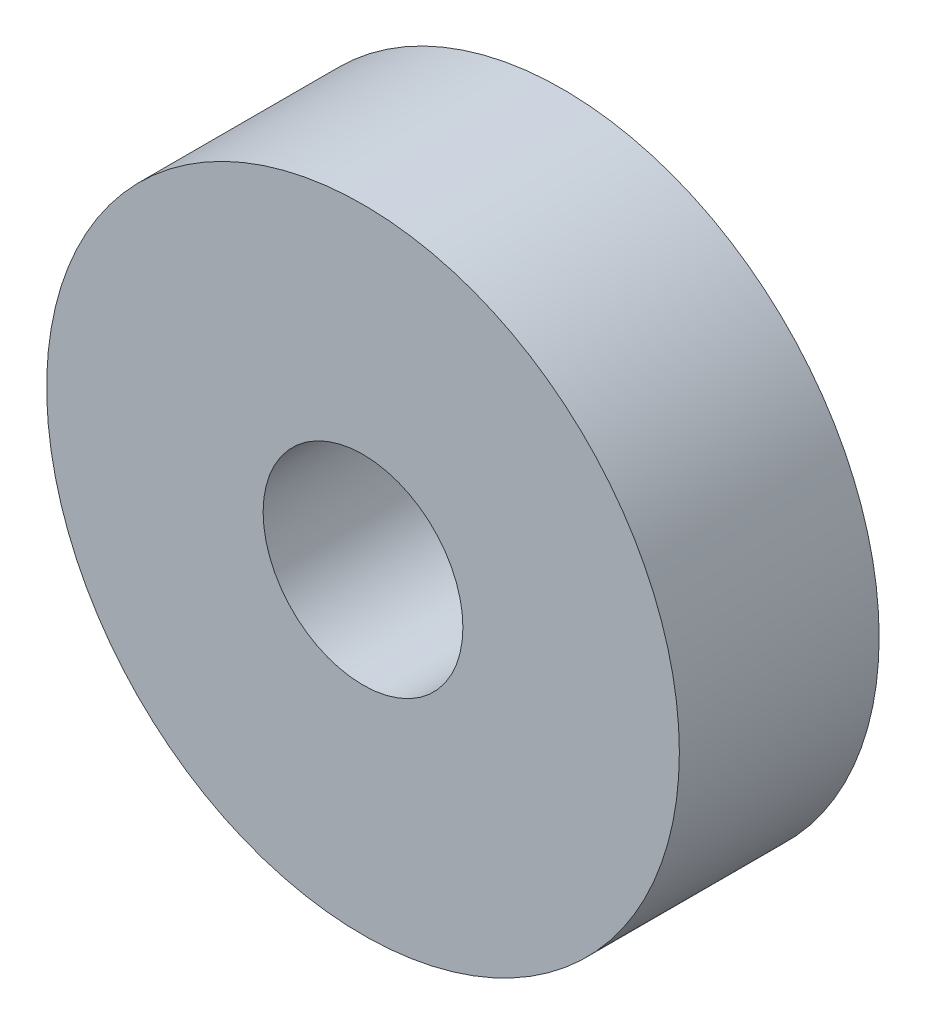
ISO-10303-21;
HEADER;
FILE_DESCRIPTION(('STEP AP214'),'2;1');
FILE_NAME('part.step','',(''),(''),'','','');
FILE_SCHEMA(('AUTOMOTIVE_DESIGN { 1 0 10303 214 1 1 1 1 }'));
ENDSEC;
DATA;
#1=APPLICATION_CONTEXT('core data for automotive mechanical design processes');
#2=APPLICATION_PROTOCOL_DEFINITION('international standard','automotive_design',2000,#1);
#3=PRODUCT_CONTEXT('',#1,'mechanical');
#4=PRODUCT('Part','Part','',(#3));
#5=PRODUCT_RELATED_PRODUCT_CATEGORY('part','',(#4));
#6=PRODUCT_DEFINITION_FORMATION('','',#4);
#7=PRODUCT_DEFINITION_CONTEXT('part definition',#1,'design');
#8=PRODUCT_DEFINITION('design','',#6,#7);
#9=PRODUCT_DEFINITION_SHAPE('','',#8);
#10=(LENGTH_UNIT() NAMED_UNIT(*) SI_UNIT(.MILLI.,.METRE.));
#11=(NAMED_UNIT(*) PLANE_ANGLE_UNIT() SI_UNIT($,.RADIAN.));
#12=(NAMED_UNIT(*) SI_UNIT($,.STERADIAN.) SOLID_ANGLE_UNIT());
#13=UNCERTAINTY_MEASURE_WITH_UNIT(LENGTH_MEASURE(1.E-05),#10,'distance_accuracy_value','');
#14=(GEOMETRIC_REPRESENTATION_CONTEXT(3) GLOBAL_UNCERTAINTY_ASSIGNED_CONTEXT((#13)) GLOBAL_UNIT_ASSIGNED_CONTEXT((#10,
#11,#12)) REPRESENTATION_CONTEXT('',''));
#15=CARTESIAN_POINT('',(0.,0.,0.));
#16=DIRECTION('',(0.,0.,1.));
#17=DIRECTION('',(1.,0.,0.));
#18=AXIS2_PLACEMENT_3D('',#15,#16,#17);
#19=CARTESIAN_POINT('',(0.,0.,6.));
#20=DIRECTION('',(0.,0.,-1.));
#21=DIRECTION('',(-1.,0.,0.));
#22=AXIS2_PLACEMENT_3D('',#19,#20,#21);
#23=CYLINDRICAL_SURFACE('',#22,9.5);
#24=CARTESIAN_POINT('',(0.,0.,6.));
#25=DIRECTION('',(0.,0.,1.));
#26=DIRECTION('',(1.,0.,0.));
#27=AXIS2_PLACEMENT_3D('',#24,#25,#26);
#28=CIRCLE('',#27,9.5);
#29=CARTESIAN_POINT('',(9.5,0.,6.));
#30=VERTEX_POINT('',#29);
#31=EDGE_CURVE('E10',#30,#30,#28,.T.);
#32=ORIENTED_EDGE('',*,*,#31,.F.);
#33=EDGE_LOOP('',(#32));
#34=FACE_BOUND('',#33,.T.);
#35=CARTESIAN_POINT('',(0.,0.,0.));
#36=DIRECTION('',(0.,0.,1.));
#37=DIRECTION('',(1.,0.,0.));
#38=AXIS2_PLACEMENT_3D('',#35,#36,#37);
#39=CIRCLE('',#38,9.5);
#40=CARTESIAN_POINT('',(9.5,0.,0.));
#41=VERTEX_POINT('',#40);
#42=EDGE_CURVE('E36',#41,#41,#39,.T.);
#43=ORIENTED_EDGE('',*,*,#42,.T.);
#44=EDGE_LOOP('',(#43));
#45=FACE_BOUND('',#44,.T.);
#46=ADVANCED_FACE('F33',(#34,#45),#23,.T.);
#47=CARTESIAN_POINT('',(0.,0.,6.));
#48=DIRECTION('',(0.,0.,1.));
#49=DIRECTION('',(1.,0.,0.));
#50=AXIS2_PLACEMENT_3D('',#47,#48,#49);
#51=PLANE('',#50);
#52=CARTESIAN_POINT('',(0.,0.,6.));
#53=DIRECTION('',(0.,0.,1.));
#54=DIRECTION('',(1.,0.,0.));
#55=AXIS2_PLACEMENT_3D('',#52,#53,#54);
#56=CIRCLE('',#55,3.);
#57=CARTESIAN_POINT('',(3.,0.,6.));
#58=VERTEX_POINT('',#57);
#59=EDGE_CURVE('E45',#58,#58,#56,.T.);
#60=ORIENTED_EDGE('',*,*,#59,.F.);
#61=EDGE_LOOP('',(#60));
#62=FACE_BOUND('',#61,.T.);
#63=ORIENTED_EDGE('',*,*,#31,.T.);
#64=EDGE_LOOP('',(#63));
#65=FACE_BOUND('',#64,.T.);
#66=ADVANCED_FACE('F60',(#62,#65),#51,.T.);
#67=CARTESIAN_POINT('',(0.,0.,0.));
#68=DIRECTION('',(0.,0.,1.));
#69=DIRECTION('',(1.,0.,0.));
#70=AXIS2_PLACEMENT_3D('',#67,#68,#69);
#71=PLANE('',#70);
#72=CARTESIAN_POINT('',(0.,0.,0.));
#73=DIRECTION('',(0.,0.,1.));
#74=DIRECTION('',(1.,0.,0.));
#75=AXIS2_PLACEMENT_3D('',#72,#73,#74);
#76=CIRCLE('',#75,3.);
#77=CARTESIAN_POINT('',(3.,0.,0.));
#78=VERTEX_POINT('',#77);
#79=EDGE_CURVE('E43',#78,#78,#76,.T.);
#80=ORIENTED_EDGE('',*,*,#79,.T.);
#81=EDGE_LOOP('',(#80));
#82=FACE_BOUND('',#81,.T.);
#83=ORIENTED_EDGE('',*,*,#42,.F.);
#84=EDGE_LOOP('',(#83));
#85=FACE_BOUND('',#84,.T.);
#86=ADVANCED_FACE('F51',(#82,#85),#71,.F.);
#87=CARTESIAN_POINT('',(0.,0.,0.));
#88=DIRECTION('',(0.,0.,1.));
#89=DIRECTION('',(1.,0.,0.));
#90=AXIS2_PLACEMENT_3D('',#87,#88,#89);
#91=CYLINDRICAL_SURFACE('',#90,3.);
#92=ORIENTED_EDGE('',*,*,#79,.F.);
#93=EDGE_LOOP('',(#92));
#94=FACE_BOUND('',#93,.T.);
#95=ORIENTED_EDGE('',*,*,#59,.T.);
#96=EDGE_LOOP('',(#95));
#97=FACE_BOUND('',#96,.T.);
#98=ADVANCED_FACE('F54',(#94,#97),#91,.F.);
#99=CLOSED_SHELL('',(#46,#66,#86,#98));
#100=MANIFOLD_SOLID_BREP('B2',#99);
#101=ADVANCED_BREP_SHAPE_REPRESENTATION('',(#18,#100),#14);
#102=SHAPE_DEFINITION_REPRESENTATION(#9,#101);
ENDSEC;
END-ISO-10303-21;
